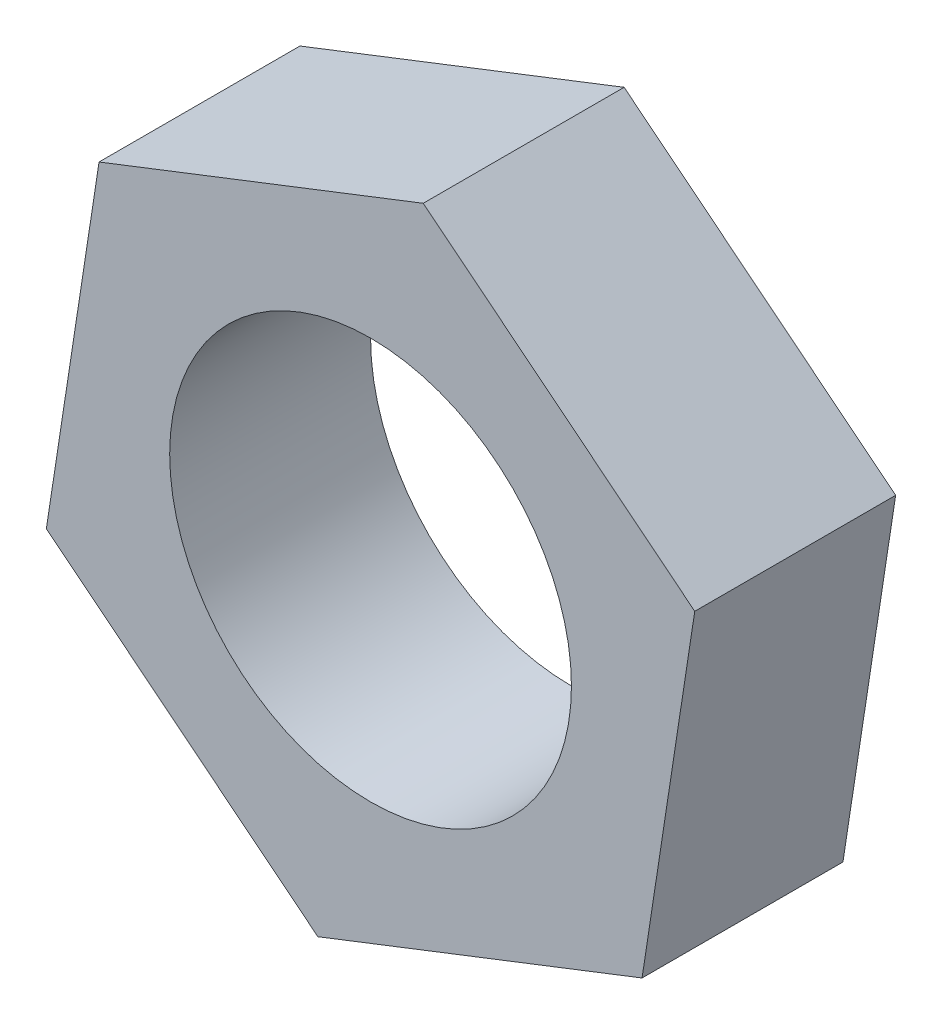
ISO-10303-21;
HEADER;
FILE_DESCRIPTION(('STEP AP214'),'2;1');
FILE_NAME('part.step','',(''),(''),'','','');
FILE_SCHEMA(('AUTOMOTIVE_DESIGN { 1 0 10303 214 1 1 1 1 }'));
ENDSEC;
DATA;
#1=APPLICATION_CONTEXT('core data for automotive mechanical design processes');
#2=APPLICATION_PROTOCOL_DEFINITION('international standard','automotive_design',2000,#1);
#3=PRODUCT_CONTEXT('',#1,'mechanical');
#4=PRODUCT('Part','Part','',(#3));
#5=PRODUCT_RELATED_PRODUCT_CATEGORY('part','',(#4));
#6=PRODUCT_DEFINITION_FORMATION('','',#4);
#7=PRODUCT_DEFINITION_CONTEXT('part definition',#1,'design');
#8=PRODUCT_DEFINITION('design','',#6,#7);
#9=PRODUCT_DEFINITION_SHAPE('','',#8);
#10=(LENGTH_UNIT() NAMED_UNIT(*) SI_UNIT(.MILLI.,.METRE.));
#11=(NAMED_UNIT(*) PLANE_ANGLE_UNIT() SI_UNIT($,.RADIAN.));
#12=(NAMED_UNIT(*) SI_UNIT($,.STERADIAN.) SOLID_ANGLE_UNIT());
#13=UNCERTAINTY_MEASURE_WITH_UNIT(LENGTH_MEASURE(1.E-05),#10,'distance_accuracy_value','');
#14=(GEOMETRIC_REPRESENTATION_CONTEXT(3) GLOBAL_UNCERTAINTY_ASSIGNED_CONTEXT((#13)) GLOBAL_UNIT_ASSIGNED_CONTEXT((#10,
#11,#12)) REPRESENTATION_CONTEXT('',''));
#15=CARTESIAN_POINT('',(0.,0.,0.));
#16=DIRECTION('',(0.,0.,1.));
#17=DIRECTION('',(1.,0.,0.));
#18=AXIS2_PLACEMENT_3D('',#15,#16,#17);
#19=CARTESIAN_POINT('',(0.,0.,1.));
#20=DIRECTION('',(0.,0.,1.));
#21=DIRECTION('',(1.,0.,0.));
#22=AXIS2_PLACEMENT_3D('',#19,#20,#21);
#23=PLANE('',#22);
#24=DIRECTION('',(0.931755382973312,0.363086637457586,0.));
#25=VECTOR('',#24,1.);
#26=CARTESIAN_POINT('',(-0.262293875581408,-1.71207532627291,1.));
#27=LINE('',#26,#25);
#28=CARTESIAN_POINT('',(-0.262293875581408,-1.71207532627291,1.));
#29=VERTEX_POINT('',#28);
#30=CARTESIAN_POINT('',(1.35155378795417,-1.08319082264703,1.));
#31=VERTEX_POINT('',#30);
#32=EDGE_CURVE('E130',#29,#31,#27,.T.);
#33=ORIENTED_EDGE('',*,*,#32,.T.);
#34=DIRECTION('',(0.151435439673716,0.98846715049658,0.));
#35=VECTOR('',#34,1.);
#36=CARTESIAN_POINT('',(1.35155378795417,-1.08319082264703,1.));
#37=LINE('',#36,#35);
#38=CARTESIAN_POINT('',(1.61384766353557,0.628884503625879,1.));
#39=VERTEX_POINT('',#38);
#40=EDGE_CURVE('E88',#31,#39,#37,.T.);
#41=ORIENTED_EDGE('',*,*,#40,.T.);
#42=DIRECTION('',(-0.780319943299596,0.625380513038994,0.));
#43=VECTOR('',#42,1.);
#44=CARTESIAN_POINT('',(1.61384766353557,0.628884503625879,1.));
#45=LINE('',#44,#43);
#46=CARTESIAN_POINT('',(0.262293875581409,1.71207532627291,1.));
#47=VERTEX_POINT('',#46);
#48=EDGE_CURVE('E101',#39,#47,#45,.T.);
#49=ORIENTED_EDGE('',*,*,#48,.T.);
#50=DIRECTION('',(-0.931755382973312,-0.363086637457585,0.));
#51=VECTOR('',#50,1.);
#52=CARTESIAN_POINT('',(0.262293875581409,1.71207532627291,1.));
#53=LINE('',#52,#51);
#54=CARTESIAN_POINT('',(-1.35155378795417,1.08319082264703,1.));
#55=VERTEX_POINT('',#54);
#56=EDGE_CURVE('E95',#47,#55,#53,.T.);
#57=ORIENTED_EDGE('',*,*,#56,.T.);
#58=DIRECTION('',(-0.151435439673717,-0.98846715049658,0.));
#59=VECTOR('',#58,1.);
#60=CARTESIAN_POINT('',(-1.35155378795417,1.08319082264703,1.));
#61=LINE('',#60,#59);
#62=CARTESIAN_POINT('',(-1.61384766353557,-0.628884503625878,1.));
#63=VERTEX_POINT('',#62);
#64=EDGE_CURVE('E99',#55,#63,#61,.T.);
#65=ORIENTED_EDGE('',*,*,#64,.T.);
#66=DIRECTION('',(0.780319943299596,-0.625380513038995,0.));
#67=VECTOR('',#66,1.);
#68=CARTESIAN_POINT('',(-1.61384766353557,-0.628884503625878,1.));
#69=LINE('',#68,#67);
#70=EDGE_CURVE('E51',#63,#29,#69,.T.);
#71=ORIENTED_EDGE('',*,*,#70,.T.);
#72=EDGE_LOOP('',(#33,#41,#49,#57,#65,#71));
#73=FACE_BOUND('',#72,.T.);
#74=CARTESIAN_POINT('',(0.,0.,1.));
#75=DIRECTION('',(0.,0.,1.));
#76=DIRECTION('',(1.,0.,0.));
#77=AXIS2_PLACEMENT_3D('',#74,#75,#76);
#78=CIRCLE('',#77,1.);
#79=CARTESIAN_POINT('',(1.,0.,1.));
#80=VERTEX_POINT('',#79);
#81=EDGE_CURVE('E123',#80,#80,#78,.T.);
#82=ORIENTED_EDGE('',*,*,#81,.F.);
#83=EDGE_LOOP('',(#82));
#84=FACE_BOUND('',#83,.T.);
#85=ADVANCED_FACE('F34',(#73,#84),#23,.T.);
#86=CARTESIAN_POINT('',(0.,0.,0.));
#87=DIRECTION('',(0.,0.,1.));
#88=DIRECTION('',(1.,0.,0.));
#89=AXIS2_PLACEMENT_3D('',#86,#87,#88);
#90=PLANE('',#89);
#91=DIRECTION('',(0.931755382973312,0.363086637457586,0.));
#92=VECTOR('',#91,1.);
#93=CARTESIAN_POINT('',(-0.262293875581408,-1.71207532627291,0.));
#94=LINE('',#93,#92);
#95=CARTESIAN_POINT('',(-0.262293875581408,-1.71207532627291,0.));
#96=VERTEX_POINT('',#95);
#97=CARTESIAN_POINT('',(1.35155378795417,-1.08319082264703,0.));
#98=VERTEX_POINT('',#97);
#99=EDGE_CURVE('E119',#96,#98,#94,.T.);
#100=ORIENTED_EDGE('',*,*,#99,.F.);
#101=DIRECTION('',(0.780319943299596,-0.625380513038995,0.));
#102=VECTOR('',#101,1.);
#103=CARTESIAN_POINT('',(-1.61384766353557,-0.628884503625878,0.));
#104=LINE('',#103,#102);
#105=CARTESIAN_POINT('',(-1.61384766353557,-0.628884503625878,0.));
#106=VERTEX_POINT('',#105);
#107=EDGE_CURVE('E80',#106,#96,#104,.T.);
#108=ORIENTED_EDGE('',*,*,#107,.F.);
#109=DIRECTION('',(-0.151435439673717,-0.98846715049658,0.));
#110=VECTOR('',#109,1.);
#111=CARTESIAN_POINT('',(-1.35155378795417,1.08319082264703,0.));
#112=LINE('',#111,#110);
#113=CARTESIAN_POINT('',(-1.35155378795417,1.08319082264703,0.));
#114=VERTEX_POINT('',#113);
#115=EDGE_CURVE('E74',#114,#106,#112,.T.);
#116=ORIENTED_EDGE('',*,*,#115,.F.);
#117=DIRECTION('',(-0.931755382973312,-0.363086637457585,0.));
#118=VECTOR('',#117,1.);
#119=CARTESIAN_POINT('',(0.262293875581409,1.71207532627291,0.));
#120=LINE('',#119,#118);
#121=CARTESIAN_POINT('',(0.262293875581409,1.71207532627291,0.));
#122=VERTEX_POINT('',#121);
#123=EDGE_CURVE('E109',#122,#114,#120,.T.);
#124=ORIENTED_EDGE('',*,*,#123,.F.);
#125=DIRECTION('',(-0.780319943299596,0.625380513038994,0.));
#126=VECTOR('',#125,1.);
#127=CARTESIAN_POINT('',(1.61384766353557,0.628884503625879,0.));
#128=LINE('',#127,#126);
#129=CARTESIAN_POINT('',(1.61384766353557,0.628884503625879,0.));
#130=VERTEX_POINT('',#129);
#131=EDGE_CURVE('E125',#130,#122,#128,.T.);
#132=ORIENTED_EDGE('',*,*,#131,.F.);
#133=DIRECTION('',(0.151435439673716,0.98846715049658,0.));
#134=VECTOR('',#133,1.);
#135=CARTESIAN_POINT('',(1.35155378795417,-1.08319082264703,0.));
#136=LINE('',#135,#134);
#137=EDGE_CURVE('E122',#98,#130,#136,.T.);
#138=ORIENTED_EDGE('',*,*,#137,.F.);
#139=EDGE_LOOP('',(#100,#108,#116,#124,#132,#138));
#140=FACE_BOUND('',#139,.T.);
#141=CARTESIAN_POINT('',(0.,0.,0.));
#142=DIRECTION('',(0.,0.,1.));
#143=DIRECTION('',(1.,0.,0.));
#144=AXIS2_PLACEMENT_3D('',#141,#142,#143);
#145=CIRCLE('',#144,1.);
#146=CARTESIAN_POINT('',(1.,0.,0.));
#147=VERTEX_POINT('',#146);
#148=EDGE_CURVE('E223',#147,#147,#145,.T.);
#149=ORIENTED_EDGE('',*,*,#148,.T.);
#150=EDGE_LOOP('',(#149));
#151=FACE_BOUND('',#150,.T.);
#152=ADVANCED_FACE('F139',(#140,#151),#90,.F.);
#153=CARTESIAN_POINT('',(-0.262293875581408,-1.71207532627291,1.));
#154=DIRECTION('',(-0.363086637457586,0.931755382973312,0.));
#155=DIRECTION('',(-0.931755382973312,-0.363086637457586,0.));
#156=AXIS2_PLACEMENT_3D('',#153,#154,#155);
#157=PLANE('',#156);
#158=ORIENTED_EDGE('',*,*,#99,.T.);
#159=DIRECTION('',(0.,0.,-1.));
#160=VECTOR('',#159,1.);
#161=CARTESIAN_POINT('',(1.35155378795417,-1.08319082264703,1.));
#162=LINE('',#161,#160);
#163=EDGE_CURVE('E11',#31,#98,#162,.T.);
#164=ORIENTED_EDGE('',*,*,#163,.F.);
#165=ORIENTED_EDGE('',*,*,#32,.F.);
#166=DIRECTION('',(0.,0.,-1.));
#167=VECTOR('',#166,1.);
#168=CARTESIAN_POINT('',(-0.262293875581408,-1.71207532627291,1.));
#169=LINE('',#168,#167);
#170=EDGE_CURVE('E115',#29,#96,#169,.T.);
#171=ORIENTED_EDGE('',*,*,#170,.T.);
#172=EDGE_LOOP('',(#158,#164,#165,#171));
#173=FACE_BOUND('',#172,.T.);
#174=ADVANCED_FACE('F36',(#173),#157,.F.);
#175=CARTESIAN_POINT('',(1.35155378795417,-1.08319082264703,1.));
#176=DIRECTION('',(-0.98846715049658,0.151435439673716,0.));
#177=DIRECTION('',(-0.151435439673716,-0.98846715049658,0.));
#178=AXIS2_PLACEMENT_3D('',#175,#176,#177);
#179=PLANE('',#178);
#180=ORIENTED_EDGE('',*,*,#137,.T.);
#181=DIRECTION('',(0.,0.,-1.));
#182=VECTOR('',#181,1.);
#183=CARTESIAN_POINT('',(1.61384766353557,0.628884503625879,1.));
#184=LINE('',#183,#182);
#185=EDGE_CURVE('E43',#39,#130,#184,.T.);
#186=ORIENTED_EDGE('',*,*,#185,.F.);
#187=ORIENTED_EDGE('',*,*,#40,.F.);
#188=ORIENTED_EDGE('',*,*,#163,.T.);
#189=EDGE_LOOP('',(#180,#186,#187,#188));
#190=FACE_BOUND('',#189,.T.);
#191=ADVANCED_FACE('F164',(#190),#179,.F.);
#192=CARTESIAN_POINT('',(1.61384766353557,0.628884503625879,1.));
#193=DIRECTION('',(-0.625380513038994,-0.780319943299596,0.));
#194=DIRECTION('',(0.780319943299596,-0.625380513038994,0.));
#195=AXIS2_PLACEMENT_3D('',#192,#193,#194);
#196=PLANE('',#195);
#197=ORIENTED_EDGE('',*,*,#131,.T.);
#198=DIRECTION('',(0.,0.,-1.));
#199=VECTOR('',#198,1.);
#200=CARTESIAN_POINT('',(0.262293875581409,1.71207532627291,1.));
#201=LINE('',#200,#199);
#202=EDGE_CURVE('E110',#47,#122,#201,.T.);
#203=ORIENTED_EDGE('',*,*,#202,.F.);
#204=ORIENTED_EDGE('',*,*,#48,.F.);
#205=ORIENTED_EDGE('',*,*,#185,.T.);
#206=EDGE_LOOP('',(#197,#203,#204,#205));
#207=FACE_BOUND('',#206,.T.);
#208=ADVANCED_FACE('F136',(#207),#196,.F.);
#209=CARTESIAN_POINT('',(0.262293875581409,1.71207532627291,1.));
#210=DIRECTION('',(0.363086637457585,-0.931755382973312,0.));
#211=DIRECTION('',(0.931755382973313,0.363086637457586,0.));
#212=AXIS2_PLACEMENT_3D('',#209,#210,#211);
#213=PLANE('',#212);
#214=ORIENTED_EDGE('',*,*,#123,.T.);
#215=DIRECTION('',(0.,0.,-1.));
#216=VECTOR('',#215,1.);
#217=CARTESIAN_POINT('',(-1.35155378795417,1.08319082264703,1.));
#218=LINE('',#217,#216);
#219=EDGE_CURVE('E106',#55,#114,#218,.T.);
#220=ORIENTED_EDGE('',*,*,#219,.F.);
#221=ORIENTED_EDGE('',*,*,#56,.F.);
#222=ORIENTED_EDGE('',*,*,#202,.T.);
#223=EDGE_LOOP('',(#214,#220,#221,#222));
#224=FACE_BOUND('',#223,.T.);
#225=ADVANCED_FACE('F107',(#224),#213,.F.);
#226=CARTESIAN_POINT('',(-1.35155378795417,1.08319082264703,1.));
#227=DIRECTION('',(0.98846715049658,-0.151435439673717,0.));
#228=DIRECTION('',(0.151435439673717,0.98846715049658,0.));
#229=AXIS2_PLACEMENT_3D('',#226,#227,#228);
#230=PLANE('',#229);
#231=ORIENTED_EDGE('',*,*,#115,.T.);
#232=DIRECTION('',(0.,0.,-1.));
#233=VECTOR('',#232,1.);
#234=CARTESIAN_POINT('',(-1.61384766353557,-0.628884503625878,1.));
#235=LINE('',#234,#233);
#236=EDGE_CURVE('E111',#63,#106,#235,.T.);
#237=ORIENTED_EDGE('',*,*,#236,.F.);
#238=ORIENTED_EDGE('',*,*,#64,.F.);
#239=ORIENTED_EDGE('',*,*,#219,.T.);
#240=EDGE_LOOP('',(#231,#237,#238,#239));
#241=FACE_BOUND('',#240,.T.);
#242=ADVANCED_FACE('F113',(#241),#230,.F.);
#243=CARTESIAN_POINT('',(-1.61384766353557,-0.628884503625878,1.));
#244=DIRECTION('',(0.625380513038995,0.780319943299596,0.));
#245=DIRECTION('',(-0.780319943299596,0.625380513038995,0.));
#246=AXIS2_PLACEMENT_3D('',#243,#244,#245);
#247=PLANE('',#246);
#248=ORIENTED_EDGE('',*,*,#107,.T.);
#249=ORIENTED_EDGE('',*,*,#170,.F.);
#250=ORIENTED_EDGE('',*,*,#70,.F.);
#251=ORIENTED_EDGE('',*,*,#236,.T.);
#252=EDGE_LOOP('',(#248,#249,#250,#251));
#253=FACE_BOUND('',#252,.T.);
#254=ADVANCED_FACE('F144',(#253),#247,.F.);
#255=CARTESIAN_POINT('',(0.,0.,1.));
#256=DIRECTION('',(0.,0.,-1.));
#257=DIRECTION('',(-1.,0.,0.));
#258=AXIS2_PLACEMENT_3D('',#255,#256,#257);
#259=CYLINDRICAL_SURFACE('',#258,1.);
#260=ORIENTED_EDGE('',*,*,#81,.T.);
#261=EDGE_LOOP('',(#260));
#262=FACE_BOUND('',#261,.T.);
#263=ORIENTED_EDGE('',*,*,#148,.F.);
#264=EDGE_LOOP('',(#263));
#265=FACE_BOUND('',#264,.T.);
#266=ADVANCED_FACE('F146',(#262,#265),#259,.F.);
#267=CLOSED_SHELL('',(#85,#152,#174,#191,#208,#225,#242,#254,#266));
#268=MANIFOLD_SOLID_BREP('B2',#267);
#269=ADVANCED_BREP_SHAPE_REPRESENTATION('',(#18,#268),#14);
#270=SHAPE_DEFINITION_REPRESENTATION(#9,#269);
ENDSEC;
END-ISO-10303-21;
